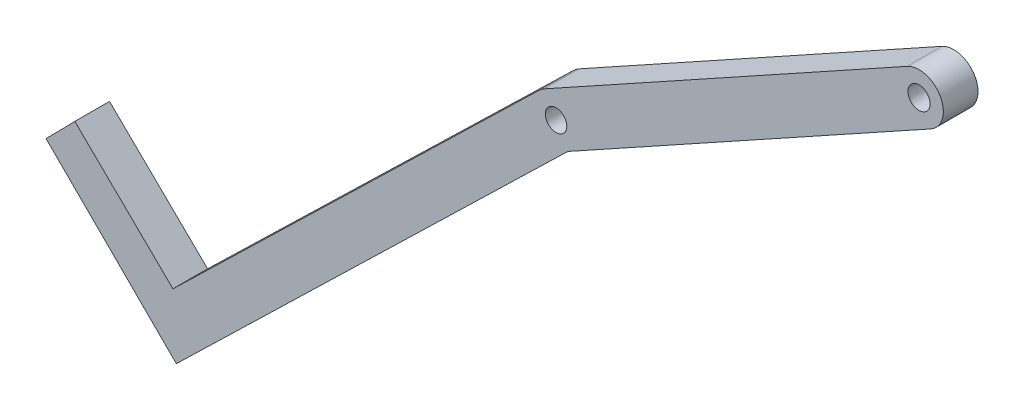
ISO-10303-21;
HEADER;
FILE_DESCRIPTION(('STEP AP214'),'2;1');
FILE_NAME('part.step','',(''),(''),'','','');
FILE_SCHEMA(('AUTOMOTIVE_DESIGN { 1 0 10303 214 1 1 1 1 }'));
ENDSEC;
DATA;
#1=APPLICATION_CONTEXT('core data for automotive mechanical design processes');
#2=APPLICATION_PROTOCOL_DEFINITION('international standard','automotive_design',2000,#1);
#3=PRODUCT_CONTEXT('',#1,'mechanical');
#4=PRODUCT('Part','Part','',(#3));
#5=PRODUCT_RELATED_PRODUCT_CATEGORY('part','',(#4));
#6=PRODUCT_DEFINITION_FORMATION('','',#4);
#7=PRODUCT_DEFINITION_CONTEXT('part definition',#1,'design');
#8=PRODUCT_DEFINITION('design','',#6,#7);
#9=PRODUCT_DEFINITION_SHAPE('','',#8);
#10=(LENGTH_UNIT() NAMED_UNIT(*) SI_UNIT(.MILLI.,.METRE.));
#11=(NAMED_UNIT(*) PLANE_ANGLE_UNIT() SI_UNIT($,.RADIAN.));
#12=(NAMED_UNIT(*) SI_UNIT($,.STERADIAN.) SOLID_ANGLE_UNIT());
#13=UNCERTAINTY_MEASURE_WITH_UNIT(LENGTH_MEASURE(1.E-05),#10,'distance_accuracy_value','');
#14=(GEOMETRIC_REPRESENTATION_CONTEXT(3) GLOBAL_UNCERTAINTY_ASSIGNED_CONTEXT((#13)) GLOBAL_UNIT_ASSIGNED_CONTEXT((#10,
#11,#12)) REPRESENTATION_CONTEXT('',''));
#15=CARTESIAN_POINT('',(0.,0.,0.));
#16=DIRECTION('',(0.,0.,1.));
#17=DIRECTION('',(1.,0.,0.));
#18=AXIS2_PLACEMENT_3D('',#15,#16,#17);
#19=CARTESIAN_POINT('',(-8.38743364883786,8.65139965799446,5.));
#20=DIRECTION('',(-0.696068741972904,0.717975143335936,0.));
#21=DIRECTION('',(-0.717975143335936,-0.696068741972904,0.));
#22=AXIS2_PLACEMENT_3D('',#19,#20,#21);
#23=PLANE('',#22);
#24=DIRECTION('',(0.717975143335936,0.696068741972904,0.));
#25=VECTOR('',#24,1.);
#26=CARTESIAN_POINT('',(-8.38743364883786,8.65139965799446,0.));
#27=LINE('',#26,#25);
#28=CARTESIAN_POINT('',(-106.835385186407,-86.7927705373262,0.));
#29=VERTEX_POINT('',#28);
#30=CARTESIAN_POINT('',(-50.37941259714,-32.0593467108685,0.));
#31=VERTEX_POINT('',#30);
#32=EDGE_CURVE('E158',#29,#31,#27,.T.);
#33=ORIENTED_EDGE('',*,*,#32,.T.);
#34=DIRECTION('',(0.,0.,-1.));
#35=VECTOR('',#34,1.);
#36=CARTESIAN_POINT('',(-50.37941259714,-32.0593467108685,5.));
#37=LINE('',#36,#35);
#38=CARTESIAN_POINT('',(-50.37941259714,-32.0593467108685,5.));
#39=VERTEX_POINT('',#38);
#40=EDGE_CURVE('E11',#39,#31,#37,.T.);
#41=ORIENTED_EDGE('',*,*,#40,.F.);
#42=DIRECTION('',(0.717975143335936,0.696068741972904,0.));
#43=VECTOR('',#42,1.);
#44=CARTESIAN_POINT('',(-8.38743364883786,8.65139965799446,5.));
#45=LINE('',#44,#43);
#46=CARTESIAN_POINT('',(-106.835385186407,-86.7927705373262,5.));
#47=VERTEX_POINT('',#46);
#48=EDGE_CURVE('E187',#47,#39,#45,.T.);
#49=ORIENTED_EDGE('',*,*,#48,.F.);
#50=DIRECTION('',(0.,0.,-1.));
#51=VECTOR('',#50,1.);
#52=CARTESIAN_POINT('',(-106.835385186407,-86.7927705373262,5.));
#53=LINE('',#52,#51);
#54=EDGE_CURVE('E157',#47,#29,#53,.T.);
#55=ORIENTED_EDGE('',*,*,#54,.T.);
#56=EDGE_LOOP('',(#33,#41,#49,#55));
#57=FACE_BOUND('',#56,.T.);
#58=ADVANCED_FACE('F41',(#57),#23,.F.);
#59=CARTESIAN_POINT('',(1.76411307660341,-3.18586736263513,5.));
#60=DIRECTION('',(-0.484422640127599,0.87483410183406,0.));
#61=DIRECTION('',(-0.87483410183406,-0.484422640127599,0.));
#62=AXIS2_PLACEMENT_3D('',#59,#60,#61);
#63=PLANE('',#62);
#64=DIRECTION('',(0.87483410183406,0.484422640127599,0.));
#65=VECTOR('',#64,1.);
#66=CARTESIAN_POINT('',(1.76411307660341,-3.18586736263513,0.));
#67=LINE('',#66,#65);
#68=CARTESIAN_POINT('',(1.97499919347214,-3.06909321164395,0.));
#69=VERTEX_POINT('',#68);
#70=EDGE_CURVE('E161',#31,#69,#67,.T.);
#71=ORIENTED_EDGE('',*,*,#70,.T.);
#72=DIRECTION('',(0.,0.,-1.));
#73=VECTOR('',#72,1.);
#74=CARTESIAN_POINT('',(1.97499919347214,-3.06909321164395,5.));
#75=LINE('',#74,#73);
#76=CARTESIAN_POINT('',(1.97499919347214,-3.06909321164395,5.));
#77=VERTEX_POINT('',#76);
#78=EDGE_CURVE('E49',#77,#69,#75,.T.);
#79=ORIENTED_EDGE('',*,*,#78,.F.);
#80=DIRECTION('',(0.87483410183406,0.484422640127599,0.));
#81=VECTOR('',#80,1.);
#82=CARTESIAN_POINT('',(1.76411307660341,-3.18586736263513,5.));
#83=LINE('',#82,#81);
#84=EDGE_CURVE('E105',#39,#77,#83,.T.);
#85=ORIENTED_EDGE('',*,*,#84,.F.);
#86=ORIENTED_EDGE('',*,*,#40,.T.);
#87=EDGE_LOOP('',(#71,#79,#85,#86));
#88=FACE_BOUND('',#87,.T.);
#89=ADVANCED_FACE('F248',(#88),#63,.F.);
#90=CARTESIAN_POINT('',(0.279519953025542,-0.00717385522473529,5.));
#91=DIRECTION('',(0.,0.,-1.));
#92=DIRECTION('',(-1.,0.,0.));
#93=AXIS2_PLACEMENT_3D('',#90,#91,#92);
#94=CYLINDRICAL_SURFACE('',#93,3.5);
#95=CARTESIAN_POINT('',(0.279519953025542,-0.00717385522473529,0.));
#96=DIRECTION('',(0.,0.,1.));
#97=DIRECTION('',(1.,0.,0.));
#98=AXIS2_PLACEMENT_3D('',#95,#96,#97);
#99=CIRCLE('',#98,3.5);
#100=CARTESIAN_POINT('',(-1.41595928742106,3.05474550119448,0.));
#101=VERTEX_POINT('',#100);
#102=EDGE_CURVE('E163',#69,#101,#99,.T.);
#103=ORIENTED_EDGE('',*,*,#102,.T.);
#104=DIRECTION('',(0.,0.,-1.));
#105=VECTOR('',#104,1.);
#106=CARTESIAN_POINT('',(-1.41595928742106,3.05474550119448,5.));
#107=LINE('',#106,#105);
#108=CARTESIAN_POINT('',(-1.41595928742106,3.05474550119448,5.));
#109=VERTEX_POINT('',#108);
#110=EDGE_CURVE('E197',#109,#101,#107,.T.);
#111=ORIENTED_EDGE('',*,*,#110,.F.);
#112=CARTESIAN_POINT('',(0.279519953025542,-0.00717385522473529,5.));
#113=DIRECTION('',(0.,0.,1.));
#114=DIRECTION('',(1.,0.,0.));
#115=AXIS2_PLACEMENT_3D('',#112,#113,#114);
#116=CIRCLE('',#115,3.5);
#117=EDGE_CURVE('E204',#77,#109,#116,.T.);
#118=ORIENTED_EDGE('',*,*,#117,.F.);
#119=ORIENTED_EDGE('',*,*,#78,.T.);
#120=EDGE_LOOP('',(#103,#111,#118,#119));
#121=FACE_BOUND('',#120,.T.);
#122=ADVANCED_FACE('F202',(#121),#94,.T.);
#123=CARTESIAN_POINT('',(-1.62684540428979,2.93797135020329,5.));
#124=DIRECTION('',(-0.484422640127599,0.87483410183406,0.));
#125=DIRECTION('',(-0.87483410183406,-0.484422640127599,0.));
#126=AXIS2_PLACEMENT_3D('',#123,#124,#125);
#127=PLANE('',#126);
#128=DIRECTION('',(0.87483410183406,0.484422640127599,0.));
#129=VECTOR('',#128,1.);
#130=CARTESIAN_POINT('',(-1.62684540428979,2.93797135020329,0.));
#131=LINE('',#130,#129);
#132=CARTESIAN_POINT('',(-53.7703710780332,-25.9355079980301,0.));
#133=VERTEX_POINT('',#132);
#134=EDGE_CURVE('E166',#133,#101,#131,.T.);
#135=ORIENTED_EDGE('',*,*,#134,.F.);
#136=DIRECTION('',(0.,0.,-1.));
#137=VECTOR('',#136,1.);
#138=CARTESIAN_POINT('',(-53.7703710780332,-25.9355079980301,5.));
#139=LINE('',#138,#137);
#140=CARTESIAN_POINT('',(-53.7703710780332,-25.9355079980301,5.));
#141=VERTEX_POINT('',#140);
#142=EDGE_CURVE('E195',#141,#133,#139,.T.);
#143=ORIENTED_EDGE('',*,*,#142,.F.);
#144=DIRECTION('',(0.87483410183406,0.484422640127599,0.));
#145=VECTOR('',#144,1.);
#146=CARTESIAN_POINT('',(-1.62684540428979,2.93797135020329,5.));
#147=LINE('',#146,#145);
#148=EDGE_CURVE('E216',#141,#109,#147,.T.);
#149=ORIENTED_EDGE('',*,*,#148,.T.);
#150=ORIENTED_EDGE('',*,*,#110,.T.);
#151=EDGE_LOOP('',(#135,#143,#149,#150));
#152=FACE_BOUND('',#151,.T.);
#153=ADVANCED_FACE('F212',(#152),#127,.T.);
#154=CARTESIAN_POINT('',(-52.0748918375866,-28.9974273544493,5.));
#155=DIRECTION('',(0.,0.,-1.));
#156=DIRECTION('',(-1.,0.,0.));
#157=AXIS2_PLACEMENT_3D('',#154,#155,#156);
#158=CYLINDRICAL_SURFACE('',#157,3.5);
#159=CARTESIAN_POINT('',(-52.0748918375866,-28.9974273544493,0.));
#160=DIRECTION('',(0.,0.,1.));
#161=DIRECTION('',(1.,0.,0.));
#162=AXIS2_PLACEMENT_3D('',#159,#160,#161);
#163=CIRCLE('',#162,3.5);
#164=CARTESIAN_POINT('',(-54.5111324344918,-26.4845143527735,0.));
#165=VERTEX_POINT('',#164);
#166=EDGE_CURVE('E169',#133,#165,#163,.T.);
#167=ORIENTED_EDGE('',*,*,#166,.T.);
#168=DIRECTION('',(0.,0.,-1.));
#169=VECTOR('',#168,1.);
#170=CARTESIAN_POINT('',(-54.5111324344918,-26.4845143527735,5.));
#171=LINE('',#170,#169);
#172=CARTESIAN_POINT('',(-54.5111324344918,-26.4845143527735,5.));
#173=VERTEX_POINT('',#172);
#174=EDGE_CURVE('E193',#173,#165,#171,.T.);
#175=ORIENTED_EDGE('',*,*,#174,.F.);
#176=CARTESIAN_POINT('',(-52.0748918375866,-28.9974273544493,5.));
#177=DIRECTION('',(0.,0.,1.));
#178=DIRECTION('',(1.,0.,0.));
#179=AXIS2_PLACEMENT_3D('',#176,#177,#178);
#180=CIRCLE('',#179,3.5);
#181=EDGE_CURVE('E217',#141,#173,#180,.T.);
#182=ORIENTED_EDGE('',*,*,#181,.F.);
#183=ORIENTED_EDGE('',*,*,#142,.T.);
#184=EDGE_LOOP('',(#167,#175,#182,#183));
#185=FACE_BOUND('',#184,.T.);
#186=ADVANCED_FACE('F259',(#185),#158,.T.);
#187=CARTESIAN_POINT('',(-13.1753787492393,13.5900290812923,5.));
#188=DIRECTION('',(-0.696068741972904,0.717975143335936,0.));
#189=DIRECTION('',(-0.717975143335936,-0.696068741972904,0.));
#190=AXIS2_PLACEMENT_3D('',#187,#188,#189);
#191=PLANE('',#190);
#192=DIRECTION('',(0.717975143335936,0.696068741972904,0.));
#193=VECTOR('',#192,1.);
#194=CARTESIAN_POINT('',(-13.1753787492393,13.5900290812923,0.));
#195=LINE('',#194,#193);
#196=CARTESIAN_POINT('',(-107.325001283288,-77.6869599938512,0.));
#197=VERTEX_POINT('',#196);
#198=EDGE_CURVE('E172',#197,#165,#195,.T.);
#199=ORIENTED_EDGE('',*,*,#198,.F.);
#200=DIRECTION('',(0.,0.,-1.));
#201=VECTOR('',#200,1.);
#202=CARTESIAN_POINT('',(-107.325001283288,-77.6869599938512,5.));
#203=LINE('',#202,#201);
#204=CARTESIAN_POINT('',(-107.325001283288,-77.6869599938512,5.));
#205=VERTEX_POINT('',#204);
#206=EDGE_CURVE('E191',#205,#197,#203,.T.);
#207=ORIENTED_EDGE('',*,*,#206,.F.);
#208=DIRECTION('',(0.717975143335936,0.696068741972904,0.));
#209=VECTOR('',#208,1.);
#210=CARTESIAN_POINT('',(-13.1753787492393,13.5900290812923,5.));
#211=LINE('',#210,#209);
#212=EDGE_CURVE('E146',#205,#173,#211,.T.);
#213=ORIENTED_EDGE('',*,*,#212,.T.);
#214=ORIENTED_EDGE('',*,*,#174,.T.);
#215=EDGE_LOOP('',(#199,#207,#213,#214));
#216=FACE_BOUND('',#215,.T.);
#217=ADVANCED_FACE('F225',(#216),#191,.T.);
#218=CARTESIAN_POINT('',(-91.2967833707404,-93.3608228967075,5.));
#219=DIRECTION('',(0.699159308456011,0.714965916250077,0.));
#220=DIRECTION('',(-0.714965916250077,0.699159308456011,0.));
#221=AXIS2_PLACEMENT_3D('',#218,#219,#220);
#222=PLANE('',#221);
#223=DIRECTION('',(0.714965916250077,-0.699159308456011,0.));
#224=VECTOR('',#223,1.);
#225=CARTESIAN_POINT('',(-91.2967833707404,-93.3608228967075,0.));
#226=LINE('',#225,#224);
#227=CARTESIAN_POINT('',(-121.473901164467,-63.8508667878654,0.));
#228=VERTEX_POINT('',#227);
#229=EDGE_CURVE('E175',#228,#197,#226,.T.);
#230=ORIENTED_EDGE('',*,*,#229,.F.);
#231=DIRECTION('',(0.,0.,-1.));
#232=VECTOR('',#231,1.);
#233=CARTESIAN_POINT('',(-121.473901164467,-63.8508667878654,5.));
#234=LINE('',#233,#232);
#235=CARTESIAN_POINT('',(-121.473901164467,-63.8508667878654,5.));
#236=VERTEX_POINT('',#235);
#237=EDGE_CURVE('E133',#236,#228,#234,.T.);
#238=ORIENTED_EDGE('',*,*,#237,.F.);
#239=DIRECTION('',(0.714965916250077,-0.699159308456011,0.));
#240=VECTOR('',#239,1.);
#241=CARTESIAN_POINT('',(-91.2967833707404,-93.3608228967075,5.));
#242=LINE('',#241,#240);
#243=EDGE_CURVE('E144',#236,#205,#242,.T.);
#244=ORIENTED_EDGE('',*,*,#243,.T.);
#245=ORIENTED_EDGE('',*,*,#206,.T.);
#246=EDGE_LOOP('',(#230,#238,#244,#245));
#247=FACE_BOUND('',#246,.T.);
#248=ADVANCED_FACE('F229',(#247),#222,.T.);
#249=CARTESIAN_POINT('',(-30.1771177937269,29.5099561088419,5.));
#250=DIRECTION('',(-0.714965916250076,0.699159308456012,0.));
#251=DIRECTION('',(-0.699159308456012,-0.714965916250076,0.));
#252=AXIS2_PLACEMENT_3D('',#249,#250,#251);
#253=PLANE('',#252);
#254=DIRECTION('',(0.699159308456012,0.714965916250076,0.));
#255=VECTOR('',#254,1.);
#256=CARTESIAN_POINT('',(-30.1771177937269,29.5099561088419,0.));
#257=LINE('',#256,#255);
#258=CARTESIAN_POINT('',(-123.810410836327,-66.2402003176694,0.));
#259=VERTEX_POINT('',#258);
#260=EDGE_CURVE('E132',#259,#228,#257,.T.);
#261=ORIENTED_EDGE('',*,*,#260,.F.);
#262=DIRECTION('',(0.,0.,-1.));
#263=VECTOR('',#262,1.);
#264=CARTESIAN_POINT('',(-123.810410836327,-66.2402003176694,5.));
#265=LINE('',#264,#263);
#266=CARTESIAN_POINT('',(-123.810410836327,-66.2402003176694,5.));
#267=VERTEX_POINT('',#266);
#268=EDGE_CURVE('E126',#267,#259,#265,.T.);
#269=ORIENTED_EDGE('',*,*,#268,.F.);
#270=DIRECTION('',(0.699159308456012,0.714965916250076,0.));
#271=VECTOR('',#270,1.);
#272=CARTESIAN_POINT('',(-30.1771177937269,29.5099561088419,5.));
#273=LINE('',#272,#271);
#274=EDGE_CURVE('E130',#267,#236,#273,.T.);
#275=ORIENTED_EDGE('',*,*,#274,.T.);
#276=ORIENTED_EDGE('',*,*,#237,.T.);
#277=EDGE_LOOP('',(#261,#269,#275,#276));
#278=FACE_BOUND('',#277,.T.);
#279=ADVANCED_FACE('F128',(#278),#253,.T.);
#280=CARTESIAN_POINT('',(-29.0218674789607,28.911194994277,5.));
#281=DIRECTION('',(0.708456310609955,-0.705754671225725,0.));
#282=DIRECTION('',(0.705754671225725,0.708456310609955,0.));
#283=AXIS2_PLACEMENT_3D('',#280,#281,#282);
#284=PLANE('',#283);
#285=DIRECTION('',(-0.705754671225725,-0.708456310609955,0.));
#286=VECTOR('',#285,1.);
#287=CARTESIAN_POINT('',(-29.0218674789607,28.911194994277,0.));
#288=LINE('',#287,#286);
#289=CARTESIAN_POINT('',(-125.631536255208,-68.0682970317548,0.));
#290=VERTEX_POINT('',#289);
#291=EDGE_CURVE('E91',#259,#290,#288,.T.);
#292=ORIENTED_EDGE('',*,*,#291,.T.);
#293=DIRECTION('',(0.,0.,-1.));
#294=VECTOR('',#293,1.);
#295=CARTESIAN_POINT('',(-125.631536255208,-68.0682970317548,5.));
#296=LINE('',#295,#294);
#297=CARTESIAN_POINT('',(-125.631536255208,-68.0682970317548,5.));
#298=VERTEX_POINT('',#297);
#299=EDGE_CURVE('E134',#298,#290,#296,.T.);
#300=ORIENTED_EDGE('',*,*,#299,.F.);
#301=DIRECTION('',(-0.705754671225725,-0.708456310609955,0.));
#302=VECTOR('',#301,1.);
#303=CARTESIAN_POINT('',(-29.0218674789607,28.911194994277,5.));
#304=LINE('',#303,#302);
#305=EDGE_CURVE('E136',#267,#298,#304,.T.);
#306=ORIENTED_EDGE('',*,*,#305,.F.);
#307=ORIENTED_EDGE('',*,*,#268,.T.);
#308=EDGE_LOOP('',(#292,#300,#306,#307));
#309=FACE_BOUND('',#308,.T.);
#310=ADVANCED_FACE('F137',(#309),#284,.F.);
#311=CARTESIAN_POINT('',(-52.0748918375866,-28.9974273544493,5.));
#312=DIRECTION('',(0.,0.,-1.));
#313=DIRECTION('',(-1.,0.,0.));
#314=AXIS2_PLACEMENT_3D('',#311,#312,#313);
#315=CYLINDRICAL_SURFACE('',#314,1.55);
#316=CARTESIAN_POINT('',(-52.0748918375866,-28.9974273544493,5.));
#317=DIRECTION('',(0.,0.,1.));
#318=DIRECTION('',(1.,0.,0.));
#319=AXIS2_PLACEMENT_3D('',#316,#317,#318);
#320=CIRCLE('',#319,1.55);
#321=CARTESIAN_POINT('',(-50.5248918375866,-28.9974273544493,5.));
#322=VERTEX_POINT('',#321);
#323=EDGE_CURVE('E151',#322,#322,#320,.T.);
#324=ORIENTED_EDGE('',*,*,#323,.T.);
#325=EDGE_LOOP('',(#324));
#326=FACE_BOUND('',#325,.T.);
#327=CARTESIAN_POINT('',(-52.0748918375866,-28.9974273544493,0.));
#328=DIRECTION('',(0.,0.,1.));
#329=DIRECTION('',(1.,0.,0.));
#330=AXIS2_PLACEMENT_3D('',#327,#328,#329);
#331=CIRCLE('',#330,1.55);
#332=CARTESIAN_POINT('',(-50.5248918375866,-28.9974273544493,0.));
#333=VERTEX_POINT('',#332);
#334=EDGE_CURVE('E181',#333,#333,#331,.T.);
#335=ORIENTED_EDGE('',*,*,#334,.F.);
#336=EDGE_LOOP('',(#335));
#337=FACE_BOUND('',#336,.T.);
#338=ADVANCED_FACE('F236',(#326,#337),#315,.F.);
#339=CARTESIAN_POINT('',(-96.6096687762473,-96.9794920260317,5.));
#340=DIRECTION('',(0.705754671225725,0.708456310609955,0.));
#341=DIRECTION('',(-0.708456310609955,0.705754671225725,0.));
#342=AXIS2_PLACEMENT_3D('',#339,#340,#341);
#343=PLANE('',#342);
#344=DIRECTION('',(0.708456310609955,-0.705754671225725,0.));
#345=VECTOR('',#344,1.);
#346=CARTESIAN_POINT('',(-96.6096687762473,-96.9794920260317,0.));
#347=LINE('',#346,#345);
#348=EDGE_CURVE('E97',#290,#29,#347,.T.);
#349=ORIENTED_EDGE('',*,*,#348,.T.);
#350=ORIENTED_EDGE('',*,*,#54,.F.);
#351=DIRECTION('',(0.708456310609955,-0.705754671225725,0.));
#352=VECTOR('',#351,1.);
#353=CARTESIAN_POINT('',(-96.6096687762473,-96.9794920260317,5.));
#354=LINE('',#353,#352);
#355=EDGE_CURVE('E57',#298,#47,#354,.T.);
#356=ORIENTED_EDGE('',*,*,#355,.F.);
#357=ORIENTED_EDGE('',*,*,#299,.T.);
#358=EDGE_LOOP('',(#349,#350,#356,#357));
#359=FACE_BOUND('',#358,.T.);
#360=ADVANCED_FACE('F233',(#359),#343,.F.);
#361=CARTESIAN_POINT('',(0.279519953025542,-0.00717385522473529,5.));
#362=DIRECTION('',(0.,0.,-1.));
#363=DIRECTION('',(-1.,0.,0.));
#364=AXIS2_PLACEMENT_3D('',#361,#362,#363);
#365=CYLINDRICAL_SURFACE('',#364,1.6);
#366=CARTESIAN_POINT('',(0.279519953025542,-0.00717385522473529,5.));
#367=DIRECTION('',(0.,0.,1.));
#368=DIRECTION('',(1.,0.,0.));
#369=AXIS2_PLACEMENT_3D('',#366,#367,#368);
#370=CIRCLE('',#369,1.6);
#371=CARTESIAN_POINT('',(1.87951995302554,-0.00717385522473529,5.));
#372=VERTEX_POINT('',#371);
#373=EDGE_CURVE('E154',#372,#372,#370,.T.);
#374=ORIENTED_EDGE('',*,*,#373,.T.);
#375=EDGE_LOOP('',(#374));
#376=FACE_BOUND('',#375,.T.);
#377=CARTESIAN_POINT('',(0.279519953025542,-0.00717385522473529,0.));
#378=DIRECTION('',(0.,0.,1.));
#379=DIRECTION('',(1.,0.,0.));
#380=AXIS2_PLACEMENT_3D('',#377,#378,#379);
#381=CIRCLE('',#380,1.6);
#382=CARTESIAN_POINT('',(1.87951995302554,-0.00717385522473529,0.));
#383=VERTEX_POINT('',#382);
#384=EDGE_CURVE('E184',#383,#383,#381,.T.);
#385=ORIENTED_EDGE('',*,*,#384,.F.);
#386=EDGE_LOOP('',(#385));
#387=FACE_BOUND('',#386,.T.);
#388=ADVANCED_FACE('F235',(#376,#387),#365,.F.);
#389=CARTESIAN_POINT('',(0.,0.,5.));
#390=DIRECTION('',(0.,0.,1.));
#391=DIRECTION('',(1.,0.,0.));
#392=AXIS2_PLACEMENT_3D('',#389,#390,#391);
#393=PLANE('',#392);
#394=ORIENTED_EDGE('',*,*,#48,.T.);
#395=ORIENTED_EDGE('',*,*,#84,.T.);
#396=ORIENTED_EDGE('',*,*,#117,.T.);
#397=ORIENTED_EDGE('',*,*,#148,.F.);
#398=ORIENTED_EDGE('',*,*,#181,.T.);
#399=ORIENTED_EDGE('',*,*,#212,.F.);
#400=ORIENTED_EDGE('',*,*,#243,.F.);
#401=ORIENTED_EDGE('',*,*,#274,.F.);
#402=ORIENTED_EDGE('',*,*,#305,.T.);
#403=ORIENTED_EDGE('',*,*,#355,.T.);
#404=EDGE_LOOP('',(#394,#395,#396,#397,#398,#399,#400,#401,#402,#403));
#405=FACE_BOUND('',#404,.T.);
#406=ORIENTED_EDGE('',*,*,#323,.F.);
#407=EDGE_LOOP('',(#406));
#408=FACE_BOUND('',#407,.T.);
#409=ORIENTED_EDGE('',*,*,#373,.F.);
#410=EDGE_LOOP('',(#409));
#411=FACE_BOUND('',#410,.T.);
#412=ADVANCED_FACE('F140',(#405,#408,#411),#393,.T.);
#413=CARTESIAN_POINT('',(0.,0.,0.));
#414=DIRECTION('',(0.,0.,1.));
#415=DIRECTION('',(1.,0.,0.));
#416=AXIS2_PLACEMENT_3D('',#413,#414,#415);
#417=PLANE('',#416);
#418=ORIENTED_EDGE('',*,*,#32,.F.);
#419=ORIENTED_EDGE('',*,*,#348,.F.);
#420=ORIENTED_EDGE('',*,*,#291,.F.);
#421=ORIENTED_EDGE('',*,*,#260,.T.);
#422=ORIENTED_EDGE('',*,*,#229,.T.);
#423=ORIENTED_EDGE('',*,*,#198,.T.);
#424=ORIENTED_EDGE('',*,*,#166,.F.);
#425=ORIENTED_EDGE('',*,*,#134,.T.);
#426=ORIENTED_EDGE('',*,*,#102,.F.);
#427=ORIENTED_EDGE('',*,*,#70,.F.);
#428=EDGE_LOOP('',(#418,#419,#420,#421,#422,#423,#424,#425,#426,#427));
#429=FACE_BOUND('',#428,.T.);
#430=ORIENTED_EDGE('',*,*,#334,.T.);
#431=EDGE_LOOP('',(#430));
#432=FACE_BOUND('',#431,.T.);
#433=ORIENTED_EDGE('',*,*,#384,.T.);
#434=EDGE_LOOP('',(#433));
#435=FACE_BOUND('',#434,.T.);
#436=ADVANCED_FACE('F207',(#429,#432,#435),#417,.F.);
#437=CLOSED_SHELL('',(#58,#89,#122,#153,#186,#217,#248,#279,#310,#338,#360,#388,#412,#436));
#438=MANIFOLD_SOLID_BREP('B2',#437);
#439=ADVANCED_BREP_SHAPE_REPRESENTATION('',(#18,#438),#14);
#440=SHAPE_DEFINITION_REPRESENTATION(#9,#439);
ENDSEC;
END-ISO-10303-21;
